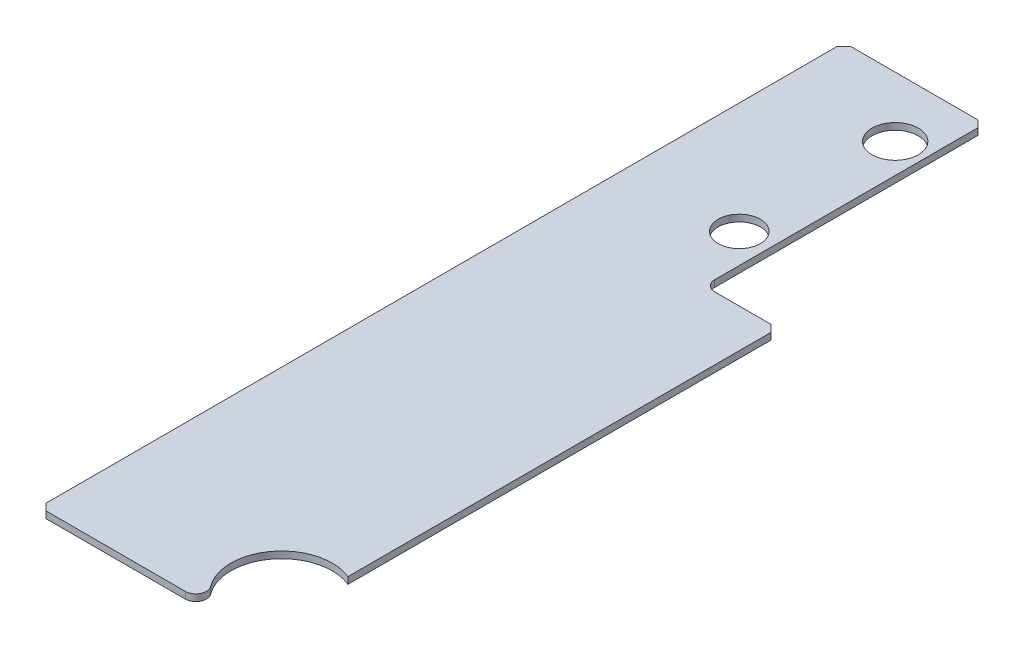
ISO-10303-21;
HEADER;
FILE_DESCRIPTION(('STEP AP214'),'2;1');
FILE_NAME('part.step','',(''),(''),'','','');
FILE_SCHEMA(('AUTOMOTIVE_DESIGN { 1 0 10303 214 1 1 1 1 }'));
ENDSEC;
DATA;
#1=APPLICATION_CONTEXT('core data for automotive mechanical design processes');
#2=APPLICATION_PROTOCOL_DEFINITION('international standard','automotive_design',2000,#1);
#3=PRODUCT_CONTEXT('',#1,'mechanical');
#4=PRODUCT('Part','Part','',(#3));
#5=PRODUCT_RELATED_PRODUCT_CATEGORY('part','',(#4));
#6=PRODUCT_DEFINITION_FORMATION('','',#4);
#7=PRODUCT_DEFINITION_CONTEXT('part definition',#1,'design');
#8=PRODUCT_DEFINITION('design','',#6,#7);
#9=PRODUCT_DEFINITION_SHAPE('','',#8);
#10=(LENGTH_UNIT() NAMED_UNIT(*) SI_UNIT(.MILLI.,.METRE.));
#11=(NAMED_UNIT(*) PLANE_ANGLE_UNIT() SI_UNIT($,.RADIAN.));
#12=(NAMED_UNIT(*) SI_UNIT($,.STERADIAN.) SOLID_ANGLE_UNIT());
#13=UNCERTAINTY_MEASURE_WITH_UNIT(LENGTH_MEASURE(1.E-05),#10,'distance_accuracy_value','');
#14=(GEOMETRIC_REPRESENTATION_CONTEXT(3) GLOBAL_UNCERTAINTY_ASSIGNED_CONTEXT((#13)) GLOBAL_UNIT_ASSIGNED_CONTEXT((#10,
#11,#12)) REPRESENTATION_CONTEXT('',''));
#15=CARTESIAN_POINT('',(0.,0.,0.));
#16=DIRECTION('',(0.,0.,1.));
#17=DIRECTION('',(1.,0.,0.));
#18=AXIS2_PLACEMENT_3D('',#15,#16,#17);
#19=CARTESIAN_POINT('',(50.8,3.175,-190.5));
#20=DIRECTION('',(-1.,0.,0.));
#21=DIRECTION('',(0.,0.,1.));
#22=AXIS2_PLACEMENT_3D('',#19,#20,#21);
#23=PLANE('',#22);
#24=DIRECTION('',(0.,0.,-1.));
#25=VECTOR('',#24,1.);
#26=CARTESIAN_POINT('',(50.8,0.,-190.5));
#27=LINE('',#26,#25);
#28=CARTESIAN_POINT('',(50.8,0.,145.984057349391));
#29=VERTEX_POINT('',#28);
#30=CARTESIAN_POINT('',(50.8,0.,-54.4828469821213));
#31=VERTEX_POINT('',#30);
#32=EDGE_CURVE('E137',#29,#31,#27,.T.);
#33=ORIENTED_EDGE('',*,*,#32,.T.);
#34=DIRECTION('',(0.,1.,0.));
#35=VECTOR('',#34,1.);
#36=CARTESIAN_POINT('',(50.8,3.175,-54.4828469821213));
#37=LINE('',#36,#35);
#38=CARTESIAN_POINT('',(50.8,3.175,-54.4828469821213));
#39=VERTEX_POINT('',#38);
#40=EDGE_CURVE('E185',#31,#39,#37,.T.);
#41=ORIENTED_EDGE('',*,*,#40,.T.);
#42=DIRECTION('',(0.,0.,-1.));
#43=VECTOR('',#42,1.);
#44=CARTESIAN_POINT('',(50.8,3.175,-190.5));
#45=LINE('',#44,#43);
#46=CARTESIAN_POINT('',(50.8,3.175,145.984057349391));
#47=VERTEX_POINT('',#46);
#48=EDGE_CURVE('E146',#47,#39,#45,.T.);
#49=ORIENTED_EDGE('',*,*,#48,.F.);
#50=DIRECTION('',(0.,1.,0.));
#51=VECTOR('',#50,1.);
#52=CARTESIAN_POINT('',(50.8,-0.00100000000000013,145.984057349391));
#53=LINE('',#52,#51);
#54=EDGE_CURVE('E132',#29,#47,#53,.T.);
#55=ORIENTED_EDGE('',*,*,#54,.F.);
#56=EDGE_LOOP('',(#33,#41,#49,#55));
#57=FACE_BOUND('',#56,.T.);
#58=ADVANCED_FACE('F34',(#57),#23,.F.);
#59=CARTESIAN_POINT('',(-50.8,3.175,-190.5));
#60=DIRECTION('',(0.,0.,1.));
#61=DIRECTION('',(1.,0.,0.));
#62=AXIS2_PLACEMENT_3D('',#59,#60,#61);
#63=PLANE('',#62);
#64=DIRECTION('',(-1.,0.,0.));
#65=VECTOR('',#64,1.);
#66=CARTESIAN_POINT('',(-50.8,3.175,-190.5));
#67=LINE('',#66,#65);
#68=CARTESIAN_POINT('',(12.7000000000001,3.175,-190.5));
#69=VERTEX_POINT('',#68);
#70=CARTESIAN_POINT('',(-47.6250000000002,3.175,-190.5));
#71=VERTEX_POINT('',#70);
#72=EDGE_CURVE('E244',#69,#71,#67,.T.);
#73=ORIENTED_EDGE('',*,*,#72,.F.);
#74=DIRECTION('',(0.,-1.,0.));
#75=VECTOR('',#74,1.);
#76=CARTESIAN_POINT('',(12.7000000000001,3.175,-190.5));
#77=LINE('',#76,#75);
#78=CARTESIAN_POINT('',(12.7000000000001,0.,-190.5));
#79=VERTEX_POINT('',#78);
#80=EDGE_CURVE('E201',#69,#79,#77,.T.);
#81=ORIENTED_EDGE('',*,*,#80,.T.);
#82=DIRECTION('',(-1.,0.,0.));
#83=VECTOR('',#82,1.);
#84=CARTESIAN_POINT('',(-50.8,0.,-190.5));
#85=LINE('',#84,#83);
#86=CARTESIAN_POINT('',(-47.6250000000002,0.,-190.5));
#87=VERTEX_POINT('',#86);
#88=EDGE_CURVE('E153',#79,#87,#85,.T.);
#89=ORIENTED_EDGE('',*,*,#88,.T.);
#90=DIRECTION('',(0.,1.,0.));
#91=VECTOR('',#90,1.);
#92=CARTESIAN_POINT('',(-47.6250000000002,3.175,-190.5));
#93=LINE('',#92,#91);
#94=EDGE_CURVE('E175',#87,#71,#93,.T.);
#95=ORIENTED_EDGE('',*,*,#94,.T.);
#96=EDGE_LOOP('',(#73,#81,#89,#95));
#97=FACE_BOUND('',#96,.T.);
#98=ADVANCED_FACE('F258',(#97),#63,.F.);
#99=CARTESIAN_POINT('',(-50.8,3.175,-190.5));
#100=DIRECTION('',(1.,0.,0.));
#101=DIRECTION('',(0.,0.,-1.));
#102=AXIS2_PLACEMENT_3D('',#99,#100,#101);
#103=PLANE('',#102);
#104=DIRECTION('',(0.,0.,1.));
#105=VECTOR('',#104,1.);
#106=CARTESIAN_POINT('',(-50.8,3.175,-190.5));
#107=LINE('',#106,#105);
#108=CARTESIAN_POINT('',(-50.8,3.175,-187.325));
#109=VERTEX_POINT('',#108);
#110=CARTESIAN_POINT('',(-50.8,3.175,187.325));
#111=VERTEX_POINT('',#110);
#112=EDGE_CURVE('E245',#109,#111,#107,.T.);
#113=ORIENTED_EDGE('',*,*,#112,.F.);
#114=DIRECTION('',(0.,-1.,0.));
#115=VECTOR('',#114,1.);
#116=CARTESIAN_POINT('',(-50.8,3.175,-187.325));
#117=LINE('',#116,#115);
#118=CARTESIAN_POINT('',(-50.8,0.,-187.325));
#119=VERTEX_POINT('',#118);
#120=EDGE_CURVE('E167',#109,#119,#117,.T.);
#121=ORIENTED_EDGE('',*,*,#120,.T.);
#122=DIRECTION('',(0.,0.,1.));
#123=VECTOR('',#122,1.);
#124=CARTESIAN_POINT('',(-50.8,0.,-190.5));
#125=LINE('',#124,#123);
#126=CARTESIAN_POINT('',(-50.8,0.,187.325));
#127=VERTEX_POINT('',#126);
#128=EDGE_CURVE('E155',#119,#127,#125,.T.);
#129=ORIENTED_EDGE('',*,*,#128,.T.);
#130=DIRECTION('',(0.,1.,0.));
#131=VECTOR('',#130,1.);
#132=CARTESIAN_POINT('',(-50.8,3.175,187.325));
#133=LINE('',#132,#131);
#134=EDGE_CURVE('E165',#127,#111,#133,.T.);
#135=ORIENTED_EDGE('',*,*,#134,.T.);
#136=EDGE_LOOP('',(#113,#121,#129,#135));
#137=FACE_BOUND('',#136,.T.);
#138=ADVANCED_FACE('F263',(#137),#103,.F.);
#139=CARTESIAN_POINT('',(-50.8,3.175,190.5));
#140=DIRECTION('',(0.,0.,-1.));
#141=DIRECTION('',(-1.,0.,0.));
#142=AXIS2_PLACEMENT_3D('',#139,#140,#141);
#143=PLANE('',#142);
#144=DIRECTION('',(1.,0.,0.));
#145=VECTOR('',#144,1.);
#146=CARTESIAN_POINT('',(-50.8,0.,190.5));
#147=LINE('',#146,#145);
#148=CARTESIAN_POINT('',(-47.6250000000001,0.,190.5));
#149=VERTEX_POINT('',#148);
#150=CARTESIAN_POINT('',(18.3423977797511,0.,190.5));
#151=VERTEX_POINT('',#150);
#152=EDGE_CURVE('E163',#149,#151,#147,.T.);
#153=ORIENTED_EDGE('',*,*,#152,.T.);
#154=DIRECTION('',(0.,1.,0.));
#155=VECTOR('',#154,1.);
#156=CARTESIAN_POINT('',(18.3423977797511,3.175,190.5));
#157=LINE('',#156,#155);
#158=CARTESIAN_POINT('',(18.3423977797511,3.175,190.5));
#159=VERTEX_POINT('',#158);
#160=EDGE_CURVE('E42',#151,#159,#157,.T.);
#161=ORIENTED_EDGE('',*,*,#160,.T.);
#162=DIRECTION('',(1.,0.,0.));
#163=VECTOR('',#162,1.);
#164=CARTESIAN_POINT('',(-50.8,3.175,190.5));
#165=LINE('',#164,#163);
#166=CARTESIAN_POINT('',(-47.6250000000001,3.175,190.5));
#167=VERTEX_POINT('',#166);
#168=EDGE_CURVE('E158',#167,#159,#165,.T.);
#169=ORIENTED_EDGE('',*,*,#168,.F.);
#170=DIRECTION('',(0.,-1.,0.));
#171=VECTOR('',#170,1.);
#172=CARTESIAN_POINT('',(-47.6250000000001,3.175,190.5));
#173=LINE('',#172,#171);
#174=EDGE_CURVE('E182',#167,#149,#173,.T.);
#175=ORIENTED_EDGE('',*,*,#174,.T.);
#176=EDGE_LOOP('',(#153,#161,#169,#175));
#177=FACE_BOUND('',#176,.T.);
#178=ADVANCED_FACE('F294',(#177),#143,.F.);
#179=CARTESIAN_POINT('',(0.,3.175,0.));
#180=DIRECTION('',(0.,1.,0.));
#181=DIRECTION('',(0.,0.,1.));
#182=AXIS2_PLACEMENT_3D('',#179,#180,#181);
#183=PLANE('',#182);
#184=ORIENTED_EDGE('',*,*,#168,.T.);
#185=CARTESIAN_POINT('',(18.3423977797511,3.175,185.5));
#186=DIRECTION('',(0.,1.,0.));
#187=DIRECTION('',(0.,0.,1.));
#188=AXIS2_PLACEMENT_3D('',#185,#186,#187);
#189=CIRCLE('',#188,5.);
#190=CARTESIAN_POINT('',(22.3403725196183,3.175,182.497301550374));
#191=VERTEX_POINT('',#190);
#192=EDGE_CURVE('E11',#159,#191,#189,.T.);
#193=ORIENTED_EDGE('',*,*,#192,.T.);
#194=CARTESIAN_POINT('',(41.5158320850272,3.175,168.095479014141));
#195=DIRECTION('',(0.,1.,0.));
#196=DIRECTION('',(0.,0.,1.));
#197=AXIS2_PLACEMENT_3D('',#194,#195,#196);
#198=CIRCLE('',#197,23.981466633836);
#199=EDGE_CURVE('E138',#47,#191,#198,.T.);
#200=ORIENTED_EDGE('',*,*,#199,.F.);
#201=ORIENTED_EDGE('',*,*,#48,.T.);
#202=DIRECTION('',(0.707106781186554,0.,0.707106781186541));
#203=VECTOR('',#202,1.);
#204=CARTESIAN_POINT('',(52.6414234910602,3.175,-52.6414234910612));
#205=LINE('',#204,#203);
#206=CARTESIAN_POINT('',(47.6249999999999,3.175,-57.6578469821213));
#207=VERTEX_POINT('',#206);
#208=EDGE_CURVE('E189',#39,#207,#205,.F.);
#209=ORIENTED_EDGE('',*,*,#208,.T.);
#210=DIRECTION('',(1.,0.,0.));
#211=VECTOR('',#210,1.);
#212=CARTESIAN_POINT('',(15.875,3.175,-57.6578469821213));
#213=LINE('',#212,#211);
#214=CARTESIAN_POINT('',(20.875,3.175,-57.6578469821213));
#215=VERTEX_POINT('',#214);
#216=EDGE_CURVE('E226',#215,#207,#213,.T.);
#217=ORIENTED_EDGE('',*,*,#216,.F.);
#218=CARTESIAN_POINT('',(20.875,3.175,-62.6578469821213));
#219=DIRECTION('',(0.,1.,0.));
#220=DIRECTION('',(0.,0.,1.));
#221=AXIS2_PLACEMENT_3D('',#218,#219,#220);
#222=CIRCLE('',#221,5.);
#223=CARTESIAN_POINT('',(15.875,3.175,-62.6578469821213));
#224=VERTEX_POINT('',#223);
#225=EDGE_CURVE('E208',#215,#224,#222,.F.);
#226=ORIENTED_EDGE('',*,*,#225,.T.);
#227=DIRECTION('',(0.,0.,1.));
#228=VECTOR('',#227,1.);
#229=CARTESIAN_POINT('',(15.875,3.175,-190.5));
#230=LINE('',#229,#228);
#231=CARTESIAN_POINT('',(15.875,3.175,-187.325));
#232=VERTEX_POINT('',#231);
#233=EDGE_CURVE('E234',#232,#224,#230,.T.);
#234=ORIENTED_EDGE('',*,*,#233,.F.);
#235=DIRECTION('',(0.707106781186541,0.,0.707106781186554));
#236=VECTOR('',#235,1.);
#237=CARTESIAN_POINT('',(101.6,3.175,-101.599999999998));
#238=LINE('',#237,#236);
#239=EDGE_CURVE('E187',#232,#69,#238,.F.);
#240=ORIENTED_EDGE('',*,*,#239,.T.);
#241=ORIENTED_EDGE('',*,*,#72,.T.);
#242=DIRECTION('',(0.707106781186541,0.,-0.707106781186554));
#243=VECTOR('',#242,1.);
#244=CARTESIAN_POINT('',(-119.0625,3.175,-119.062499999998));
#245=LINE('',#244,#243);
#246=EDGE_CURVE('E180',#71,#109,#245,.F.);
#247=ORIENTED_EDGE('',*,*,#246,.T.);
#248=ORIENTED_EDGE('',*,*,#112,.T.);
#249=DIRECTION('',(-0.707106781186541,0.,-0.707106781186554));
#250=VECTOR('',#249,1.);
#251=CARTESIAN_POINT('',(-119.0625,3.175,119.062499999998));
#252=LINE('',#251,#250);
#253=EDGE_CURVE('E178',#111,#167,#252,.F.);
#254=ORIENTED_EDGE('',*,*,#253,.T.);
#255=EDGE_LOOP('',(#184,#193,#200,#201,#209,#217,#226,#234,#240,#241,#247,#248,#254));
#256=FACE_BOUND('',#255,.T.);
#257=CARTESIAN_POINT('',(1.89864999999998,3.175,-162.0774));
#258=DIRECTION('',(0.,1.,0.));
#259=DIRECTION('',(0.,0.,1.));
#260=AXIS2_PLACEMENT_3D('',#257,#258,#259);
#261=CIRCLE('',#260,10.9520884680658);
#262=CARTESIAN_POINT('',(1.89864999999998,3.175,-151.125311531934));
#263=VERTEX_POINT('',#262);
#264=EDGE_CURVE('E416',#263,#263,#261,.T.);
#265=ORIENTED_EDGE('',*,*,#264,.F.);
#266=EDGE_LOOP('',(#265));
#267=FACE_BOUND('',#266,.T.);
#268=CARTESIAN_POINT('',(1.89864999999998,3.175,-88.2650000000002));
#269=DIRECTION('',(0.,1.,0.));
#270=DIRECTION('',(0.,0.,1.));
#271=AXIS2_PLACEMENT_3D('',#268,#269,#270);
#272=CIRCLE('',#271,9.99656611652424);
#273=CARTESIAN_POINT('',(1.89864999999998,3.175,-78.268433883476));
#274=VERTEX_POINT('',#273);
#275=EDGE_CURVE('E225',#274,#274,#272,.T.);
#276=ORIENTED_EDGE('',*,*,#275,.F.);
#277=EDGE_LOOP('',(#276));
#278=FACE_BOUND('',#277,.T.);
#279=ADVANCED_FACE('F232',(#256,#267,#278),#183,.T.);
#280=CARTESIAN_POINT('',(0.,0.,0.));
#281=DIRECTION('',(0.,1.,0.));
#282=DIRECTION('',(0.,0.,1.));
#283=AXIS2_PLACEMENT_3D('',#280,#281,#282);
#284=PLANE('',#283);
#285=CARTESIAN_POINT('',(1.89864999999998,0.,-162.0774));
#286=DIRECTION('',(0.,1.,0.));
#287=DIRECTION('',(0.,0.,1.));
#288=AXIS2_PLACEMENT_3D('',#285,#286,#287);
#289=CIRCLE('',#288,10.9520884680658);
#290=CARTESIAN_POINT('',(1.89864999999998,0.,-151.125311531934));
#291=VERTEX_POINT('',#290);
#292=EDGE_CURVE('E147',#291,#291,#289,.F.);
#293=ORIENTED_EDGE('',*,*,#292,.F.);
#294=EDGE_LOOP('',(#293));
#295=FACE_BOUND('',#294,.T.);
#296=CARTESIAN_POINT('',(1.89864999999998,0.,-88.2650000000002));
#297=DIRECTION('',(0.,1.,0.));
#298=DIRECTION('',(0.,0.,1.));
#299=AXIS2_PLACEMENT_3D('',#296,#297,#298);
#300=CIRCLE('',#299,9.99656611652424);
#301=CARTESIAN_POINT('',(1.89864999999998,0.,-78.268433883476));
#302=VERTEX_POINT('',#301);
#303=EDGE_CURVE('E420',#302,#302,#300,.F.);
#304=ORIENTED_EDGE('',*,*,#303,.F.);
#305=EDGE_LOOP('',(#304));
#306=FACE_BOUND('',#305,.T.);
#307=CARTESIAN_POINT('',(41.5158320850272,0.,168.095479014141));
#308=DIRECTION('',(0.,1.,0.));
#309=DIRECTION('',(0.,0.,1.));
#310=AXIS2_PLACEMENT_3D('',#307,#308,#309);
#311=CIRCLE('',#310,23.981466633836);
#312=CARTESIAN_POINT('',(22.3403725196183,0.,182.497301550374));
#313=VERTEX_POINT('',#312);
#314=EDGE_CURVE('E128',#313,#29,#311,.F.);
#315=ORIENTED_EDGE('',*,*,#314,.F.);
#316=CARTESIAN_POINT('',(18.3423977797511,0.,185.5));
#317=DIRECTION('',(0.,1.,0.));
#318=DIRECTION('',(0.,0.,1.));
#319=AXIS2_PLACEMENT_3D('',#316,#317,#318);
#320=CIRCLE('',#319,5.);
#321=EDGE_CURVE('E56',#313,#151,#320,.F.);
#322=ORIENTED_EDGE('',*,*,#321,.T.);
#323=ORIENTED_EDGE('',*,*,#152,.F.);
#324=DIRECTION('',(0.707106781186541,0.,0.707106781186554));
#325=VECTOR('',#324,1.);
#326=CARTESIAN_POINT('',(-47.6250000000001,0.,190.5));
#327=LINE('',#326,#325);
#328=EDGE_CURVE('E170',#149,#127,#327,.F.);
#329=ORIENTED_EDGE('',*,*,#328,.T.);
#330=ORIENTED_EDGE('',*,*,#128,.F.);
#331=DIRECTION('',(-0.707106781186541,0.,0.707106781186554));
#332=VECTOR('',#331,1.);
#333=CARTESIAN_POINT('',(-50.8,0.,-187.325));
#334=LINE('',#333,#332);
#335=EDGE_CURVE('E172',#119,#87,#334,.F.);
#336=ORIENTED_EDGE('',*,*,#335,.T.);
#337=ORIENTED_EDGE('',*,*,#88,.F.);
#338=DIRECTION('',(-0.707106781186541,0.,-0.707106781186554));
#339=VECTOR('',#338,1.);
#340=CARTESIAN_POINT('',(15.875,0.,-187.325));
#341=LINE('',#340,#339);
#342=CARTESIAN_POINT('',(15.875,0.,-187.325));
#343=VERTEX_POINT('',#342);
#344=EDGE_CURVE('E194',#79,#343,#341,.F.);
#345=ORIENTED_EDGE('',*,*,#344,.T.);
#346=DIRECTION('',(0.,0.,-1.));
#347=VECTOR('',#346,1.);
#348=CARTESIAN_POINT('',(15.875,0.,-190.5));
#349=LINE('',#348,#347);
#350=CARTESIAN_POINT('',(15.875,0.,-62.6578469821213));
#351=VERTEX_POINT('',#350);
#352=EDGE_CURVE('E217',#351,#343,#349,.T.);
#353=ORIENTED_EDGE('',*,*,#352,.F.);
#354=CARTESIAN_POINT('',(20.875,0.,-62.6578469821213));
#355=DIRECTION('',(0.,1.,0.));
#356=DIRECTION('',(0.,0.,1.));
#357=AXIS2_PLACEMENT_3D('',#354,#355,#356);
#358=CIRCLE('',#357,5.);
#359=CARTESIAN_POINT('',(20.875,0.,-57.6578469821213));
#360=VERTEX_POINT('',#359);
#361=EDGE_CURVE('E210',#351,#360,#358,.T.);
#362=ORIENTED_EDGE('',*,*,#361,.T.);
#363=DIRECTION('',(-1.,0.,0.));
#364=VECTOR('',#363,1.);
#365=CARTESIAN_POINT('',(15.875,0.,-57.6578469821213));
#366=LINE('',#365,#364);
#367=CARTESIAN_POINT('',(47.6249999999999,0.,-57.6578469821213));
#368=VERTEX_POINT('',#367);
#369=EDGE_CURVE('E216',#368,#360,#366,.T.);
#370=ORIENTED_EDGE('',*,*,#369,.F.);
#371=DIRECTION('',(-0.707106781186554,0.,-0.707106781186541));
#372=VECTOR('',#371,1.);
#373=CARTESIAN_POINT('',(50.8,0.,-54.4828469821213));
#374=LINE('',#373,#372);
#375=EDGE_CURVE('E152',#368,#31,#374,.F.);
#376=ORIENTED_EDGE('',*,*,#375,.T.);
#377=ORIENTED_EDGE('',*,*,#32,.F.);
#378=EDGE_LOOP('',(#315,#322,#323,#329,#330,#336,#337,#345,#353,#362,#370,#376,#377));
#379=FACE_BOUND('',#378,.T.);
#380=ADVANCED_FACE('F149',(#295,#306,#379),#284,.F.);
#381=CARTESIAN_POINT('',(-50.8,3.175,-187.325));
#382=DIRECTION('',(0.707106781186554,0.,0.707106781186541));
#383=DIRECTION('',(0.,-1.,0.));
#384=AXIS2_PLACEMENT_3D('',#381,#382,#383);
#385=PLANE('',#384);
#386=ORIENTED_EDGE('',*,*,#246,.F.);
#387=ORIENTED_EDGE('',*,*,#94,.F.);
#388=ORIENTED_EDGE('',*,*,#335,.F.);
#389=ORIENTED_EDGE('',*,*,#120,.F.);
#390=EDGE_LOOP('',(#386,#387,#388,#389));
#391=FACE_BOUND('',#390,.T.);
#392=ADVANCED_FACE('F268',(#391),#385,.F.);
#393=CARTESIAN_POINT('',(-47.6250000000001,3.175,190.5));
#394=DIRECTION('',(0.707106781186554,0.,-0.707106781186541));
#395=DIRECTION('',(0.,-1.,0.));
#396=AXIS2_PLACEMENT_3D('',#393,#394,#395);
#397=PLANE('',#396);
#398=ORIENTED_EDGE('',*,*,#253,.F.);
#399=ORIENTED_EDGE('',*,*,#134,.F.);
#400=ORIENTED_EDGE('',*,*,#328,.F.);
#401=ORIENTED_EDGE('',*,*,#174,.F.);
#402=EDGE_LOOP('',(#398,#399,#400,#401));
#403=FACE_BOUND('',#402,.T.);
#404=ADVANCED_FACE('F271',(#403),#397,.F.);
#405=CARTESIAN_POINT('',(15.875,-0.00100000000000013,-190.5));
#406=DIRECTION('',(-1.,0.,0.));
#407=DIRECTION('',(0.,0.,1.));
#408=AXIS2_PLACEMENT_3D('',#405,#406,#407);
#409=PLANE('',#408);
#410=ORIENTED_EDGE('',*,*,#233,.T.);
#411=DIRECTION('',(0.,1.,0.));
#412=VECTOR('',#411,1.);
#413=CARTESIAN_POINT('',(15.875,0.,-62.6578469821213));
#414=LINE('',#413,#412);
#415=EDGE_CURVE('E206',#224,#351,#414,.F.);
#416=ORIENTED_EDGE('',*,*,#415,.T.);
#417=ORIENTED_EDGE('',*,*,#352,.T.);
#418=DIRECTION('',(0.,1.,0.));
#419=VECTOR('',#418,1.);
#420=CARTESIAN_POINT('',(15.875,-0.00100000000000013,-187.325));
#421=LINE('',#420,#419);
#422=EDGE_CURVE('E198',#343,#232,#421,.T.);
#423=ORIENTED_EDGE('',*,*,#422,.T.);
#424=EDGE_LOOP('',(#410,#416,#417,#423));
#425=FACE_BOUND('',#424,.T.);
#426=ADVANCED_FACE('F236',(#425),#409,.F.);
#427=CARTESIAN_POINT('',(15.875,-0.00100000000000013,-57.6578469821213));
#428=DIRECTION('',(0.,0.,1.));
#429=DIRECTION('',(1.,0.,0.));
#430=AXIS2_PLACEMENT_3D('',#427,#428,#429);
#431=PLANE('',#430);
#432=ORIENTED_EDGE('',*,*,#369,.T.);
#433=DIRECTION('',(0.,1.,0.));
#434=VECTOR('',#433,1.);
#435=CARTESIAN_POINT('',(20.875,3.175,-57.6578469821213));
#436=LINE('',#435,#434);
#437=EDGE_CURVE('E203',#360,#215,#436,.T.);
#438=ORIENTED_EDGE('',*,*,#437,.T.);
#439=ORIENTED_EDGE('',*,*,#216,.T.);
#440=DIRECTION('',(0.,-1.,0.));
#441=VECTOR('',#440,1.);
#442=CARTESIAN_POINT('',(47.6249999999999,-0.00100000000000013,-57.6578469821213));
#443=LINE('',#442,#441);
#444=EDGE_CURVE('E192',#207,#368,#443,.T.);
#445=ORIENTED_EDGE('',*,*,#444,.T.);
#446=EDGE_LOOP('',(#432,#438,#439,#445));
#447=FACE_BOUND('',#446,.T.);
#448=ADVANCED_FACE('F222',(#447),#431,.F.);
#449=CARTESIAN_POINT('',(1.89864999999998,-0.00100000000000013,-88.2650000000002));
#450=DIRECTION('',(0.,1.,0.));
#451=DIRECTION('',(0.,0.,1.));
#452=AXIS2_PLACEMENT_3D('',#449,#450,#451);
#453=CYLINDRICAL_SURFACE('',#452,9.99656611652424);
#454=ORIENTED_EDGE('',*,*,#275,.T.);
#455=EDGE_LOOP('',(#454));
#456=FACE_BOUND('',#455,.T.);
#457=ORIENTED_EDGE('',*,*,#303,.T.);
#458=EDGE_LOOP('',(#457));
#459=FACE_BOUND('',#458,.T.);
#460=ADVANCED_FACE('F310',(#456,#459),#453,.F.);
#461=CARTESIAN_POINT('',(1.89864999999998,-0.00100000000000013,-162.0774));
#462=DIRECTION('',(0.,1.,0.));
#463=DIRECTION('',(0.,0.,1.));
#464=AXIS2_PLACEMENT_3D('',#461,#462,#463);
#465=CYLINDRICAL_SURFACE('',#464,10.9520884680658);
#466=ORIENTED_EDGE('',*,*,#264,.T.);
#467=EDGE_LOOP('',(#466));
#468=FACE_BOUND('',#467,.T.);
#469=ORIENTED_EDGE('',*,*,#292,.T.);
#470=EDGE_LOOP('',(#469));
#471=FACE_BOUND('',#470,.T.);
#472=ADVANCED_FACE('F313',(#468,#471),#465,.F.);
#473=CARTESIAN_POINT('',(41.5158320850272,-0.00100000000000013,168.095479014141));
#474=DIRECTION('',(0.,1.,0.));
#475=DIRECTION('',(0.,0.,1.));
#476=AXIS2_PLACEMENT_3D('',#473,#474,#475);
#477=CYLINDRICAL_SURFACE('',#476,23.981466633836);
#478=ORIENTED_EDGE('',*,*,#199,.T.);
#479=DIRECTION('',(0.,1.,0.));
#480=VECTOR('',#479,1.);
#481=CARTESIAN_POINT('',(22.3403725196183,-0.00100000000000013,182.497301550374));
#482=LINE('',#481,#480);
#483=EDGE_CURVE('E135',#191,#313,#482,.F.);
#484=ORIENTED_EDGE('',*,*,#483,.T.);
#485=ORIENTED_EDGE('',*,*,#314,.T.);
#486=ORIENTED_EDGE('',*,*,#54,.T.);
#487=EDGE_LOOP('',(#478,#484,#485,#486));
#488=FACE_BOUND('',#487,.T.);
#489=ADVANCED_FACE('F131',(#488),#477,.F.);
#490=CARTESIAN_POINT('',(50.8,3.175,-54.4828469821213));
#491=DIRECTION('',(-0.707106781186541,0.,0.707106781186555));
#492=DIRECTION('',(0.,1.,0.));
#493=AXIS2_PLACEMENT_3D('',#490,#491,#492);
#494=PLANE('',#493);
#495=ORIENTED_EDGE('',*,*,#375,.F.);
#496=ORIENTED_EDGE('',*,*,#444,.F.);
#497=ORIENTED_EDGE('',*,*,#208,.F.);
#498=ORIENTED_EDGE('',*,*,#40,.F.);
#499=EDGE_LOOP('',(#495,#496,#497,#498));
#500=FACE_BOUND('',#499,.T.);
#501=ADVANCED_FACE('F276',(#500),#494,.F.);
#502=CARTESIAN_POINT('',(15.875,-0.00100000000000013,-187.325));
#503=DIRECTION('',(-0.707106781186554,0.,0.707106781186541));
#504=DIRECTION('',(0.,1.,0.));
#505=AXIS2_PLACEMENT_3D('',#502,#503,#504);
#506=PLANE('',#505);
#507=ORIENTED_EDGE('',*,*,#344,.F.);
#508=ORIENTED_EDGE('',*,*,#80,.F.);
#509=ORIENTED_EDGE('',*,*,#239,.F.);
#510=ORIENTED_EDGE('',*,*,#422,.F.);
#511=EDGE_LOOP('',(#507,#508,#509,#510));
#512=FACE_BOUND('',#511,.T.);
#513=ADVANCED_FACE('F256',(#512),#506,.F.);
#514=CARTESIAN_POINT('',(20.875,-0.00100000000000013,-62.6578469821213));
#515=DIRECTION('',(0.,-1.,0.));
#516=DIRECTION('',(0.,0.,-1.));
#517=AXIS2_PLACEMENT_3D('',#514,#515,#516);
#518=CYLINDRICAL_SURFACE('',#517,5.);
#519=ORIENTED_EDGE('',*,*,#361,.F.);
#520=ORIENTED_EDGE('',*,*,#415,.F.);
#521=ORIENTED_EDGE('',*,*,#225,.F.);
#522=ORIENTED_EDGE('',*,*,#437,.F.);
#523=EDGE_LOOP('',(#519,#520,#521,#522));
#524=FACE_BOUND('',#523,.T.);
#525=ADVANCED_FACE('F228',(#524),#518,.F.);
#526=CARTESIAN_POINT('',(18.3423977797511,-0.00100000000000013,185.5));
#527=DIRECTION('',(0.,1.,0.));
#528=DIRECTION('',(0.,0.,1.));
#529=AXIS2_PLACEMENT_3D('',#526,#527,#528);
#530=CYLINDRICAL_SURFACE('',#529,5.);
#531=ORIENTED_EDGE('',*,*,#192,.F.);
#532=ORIENTED_EDGE('',*,*,#160,.F.);
#533=ORIENTED_EDGE('',*,*,#321,.F.);
#534=ORIENTED_EDGE('',*,*,#483,.F.);
#535=EDGE_LOOP('',(#531,#532,#533,#534));
#536=FACE_BOUND('',#535,.T.);
#537=ADVANCED_FACE('F36',(#536),#530,.T.);
#538=CLOSED_SHELL('',(#58,#98,#138,#178,#279,#380,#392,#404,#426,#448,#460,#472,#489,#501,#513,
#525,#537));
#539=MANIFOLD_SOLID_BREP('B2',#538);
#540=ADVANCED_BREP_SHAPE_REPRESENTATION('',(#18,#539),#14);
#541=SHAPE_DEFINITION_REPRESENTATION(#9,#540);
ENDSEC;
END-ISO-10303-21;
